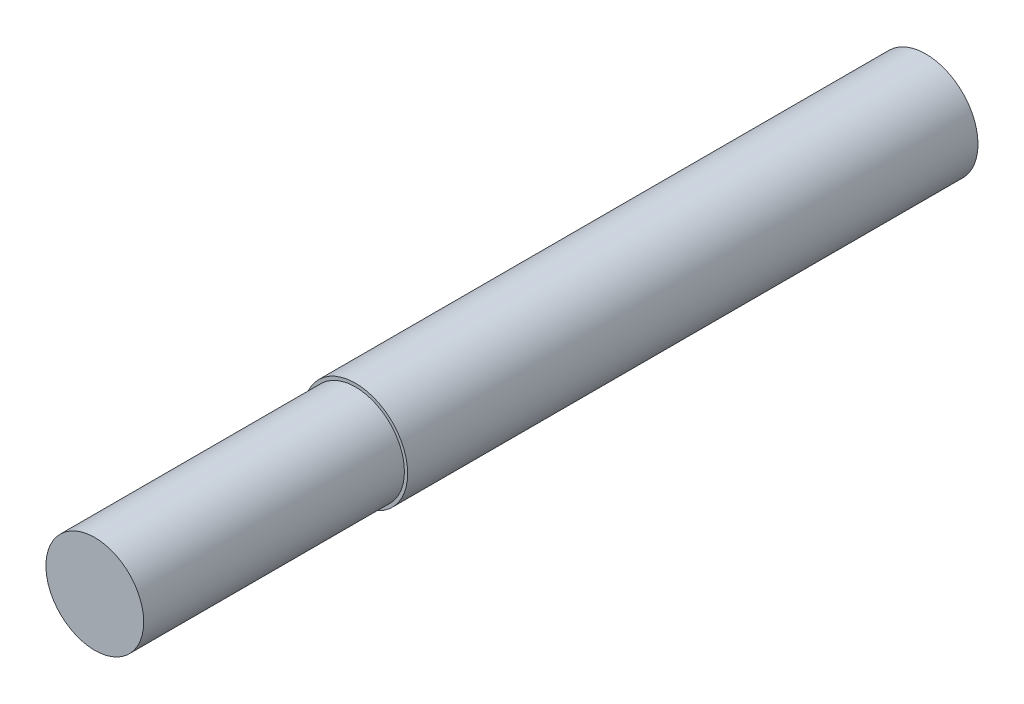
ISO-10303-21;
HEADER;
FILE_DESCRIPTION(('STEP AP214'),'2;1');
FILE_NAME('part.step','',(''),(''),'','','');
FILE_SCHEMA(('AUTOMOTIVE_DESIGN { 1 0 10303 214 1 1 1 1 }'));
ENDSEC;
DATA;
#1=APPLICATION_CONTEXT('core data for automotive mechanical design processes');
#2=APPLICATION_PROTOCOL_DEFINITION('international standard','automotive_design',2000,#1);
#3=PRODUCT_CONTEXT('',#1,'mechanical');
#4=PRODUCT('Part','Part','',(#3));
#5=PRODUCT_RELATED_PRODUCT_CATEGORY('part','',(#4));
#6=PRODUCT_DEFINITION_FORMATION('','',#4);
#7=PRODUCT_DEFINITION_CONTEXT('part definition',#1,'design');
#8=PRODUCT_DEFINITION('design','',#6,#7);
#9=PRODUCT_DEFINITION_SHAPE('','',#8);
#10=(LENGTH_UNIT() NAMED_UNIT(*) SI_UNIT(.MILLI.,.METRE.));
#11=(NAMED_UNIT(*) PLANE_ANGLE_UNIT() SI_UNIT($,.RADIAN.));
#12=(NAMED_UNIT(*) SI_UNIT($,.STERADIAN.) SOLID_ANGLE_UNIT());
#13=UNCERTAINTY_MEASURE_WITH_UNIT(LENGTH_MEASURE(1.E-05),#10,'distance_accuracy_value','');
#14=(GEOMETRIC_REPRESENTATION_CONTEXT(3) GLOBAL_UNCERTAINTY_ASSIGNED_CONTEXT((#13)) GLOBAL_UNIT_ASSIGNED_CONTEXT((#10,
#11,#12)) REPRESENTATION_CONTEXT('',''));
#15=CARTESIAN_POINT('',(0.,0.,0.));
#16=DIRECTION('',(0.,0.,1.));
#17=DIRECTION('',(1.,0.,0.));
#18=AXIS2_PLACEMENT_3D('',#15,#16,#17);
#19=CARTESIAN_POINT('',(0.,0.,0.));
#20=DIRECTION('',(0.,0.,-1.));
#21=DIRECTION('',(-1.,0.,0.));
#22=AXIS2_PLACEMENT_3D('',#19,#20,#21);
#23=PLANE('',#22);
#24=CARTESIAN_POINT('',(0.,0.,0.));
#25=DIRECTION('',(0.,0.,1.));
#26=DIRECTION('',(1.,0.,0.));
#27=AXIS2_PLACEMENT_3D('',#24,#25,#26);
#28=CIRCLE('',#27,1.5);
#29=CARTESIAN_POINT('',(1.5,0.,0.));
#30=VERTEX_POINT('',#29);
#31=EDGE_CURVE('E10',#30,#30,#28,.T.);
#32=ORIENTED_EDGE('',*,*,#31,.T.);
#33=EDGE_LOOP('',(#32));
#34=FACE_BOUND('',#33,.T.);
#35=ADVANCED_FACE('F30',(#34),#23,.F.);
#36=CARTESIAN_POINT('',(0.,0.,0.));
#37=DIRECTION('',(0.,0.,1.));
#38=DIRECTION('',(1.,0.,0.));
#39=AXIS2_PLACEMENT_3D('',#36,#37,#38);
#40=CYLINDRICAL_SURFACE('',#39,1.5);
#41=ORIENTED_EDGE('',*,*,#31,.F.);
#42=EDGE_LOOP('',(#41));
#43=FACE_BOUND('',#42,.T.);
#44=CARTESIAN_POINT('',(0.,0.,-8.));
#45=DIRECTION('',(0.,0.,1.));
#46=DIRECTION('',(1.,0.,0.));
#47=AXIS2_PLACEMENT_3D('',#44,#45,#46);
#48=CIRCLE('',#47,1.5);
#49=CARTESIAN_POINT('',(1.5,0.,-8.));
#50=VERTEX_POINT('',#49);
#51=EDGE_CURVE('E36',#50,#50,#48,.T.);
#52=ORIENTED_EDGE('',*,*,#51,.T.);
#53=EDGE_LOOP('',(#52));
#54=FACE_BOUND('',#53,.T.);
#55=ADVANCED_FACE('F68',(#43,#54),#40,.T.);
#56=CARTESIAN_POINT('',(-1.5,0.,-8.));
#57=DIRECTION('',(0.,0.,-1.));
#58=DIRECTION('',(-1.,0.,0.));
#59=AXIS2_PLACEMENT_3D('',#56,#57,#58);
#60=PLANE('',#59);
#61=ORIENTED_EDGE('',*,*,#51,.F.);
#62=EDGE_LOOP('',(#61));
#63=FACE_BOUND('',#62,.T.);
#64=CARTESIAN_POINT('',(0.,0.,-8.));
#65=DIRECTION('',(0.,0.,1.));
#66=DIRECTION('',(1.,0.,0.));
#67=AXIS2_PLACEMENT_3D('',#64,#65,#66);
#68=CIRCLE('',#67,1.6);
#69=CARTESIAN_POINT('',(1.6,0.,-8.));
#70=VERTEX_POINT('',#69);
#71=EDGE_CURVE('E40',#70,#70,#68,.T.);
#72=ORIENTED_EDGE('',*,*,#71,.T.);
#73=EDGE_LOOP('',(#72));
#74=FACE_BOUND('',#73,.T.);
#75=ADVANCED_FACE('F72',(#63,#74),#60,.F.);
#76=CARTESIAN_POINT('',(0.,0.,0.));
#77=DIRECTION('',(0.,0.,1.));
#78=DIRECTION('',(1.,0.,0.));
#79=AXIS2_PLACEMENT_3D('',#76,#77,#78);
#80=CYLINDRICAL_SURFACE('',#79,1.6);
#81=ORIENTED_EDGE('',*,*,#71,.F.);
#82=EDGE_LOOP('',(#81));
#83=FACE_BOUND('',#82,.T.);
#84=CARTESIAN_POINT('',(0.,0.,-25.5));
#85=DIRECTION('',(0.,0.,1.));
#86=DIRECTION('',(1.,0.,0.));
#87=AXIS2_PLACEMENT_3D('',#84,#85,#86);
#88=CIRCLE('',#87,1.6);
#89=CARTESIAN_POINT('',(1.6,0.,-25.5));
#90=VERTEX_POINT('',#89);
#91=EDGE_CURVE('E44',#90,#90,#88,.T.);
#92=ORIENTED_EDGE('',*,*,#91,.T.);
#93=EDGE_LOOP('',(#92));
#94=FACE_BOUND('',#93,.T.);
#95=ADVANCED_FACE('F77',(#83,#94),#80,.T.);
#96=CARTESIAN_POINT('',(-1.6,0.,-25.5));
#97=DIRECTION('',(0.,0.,1.));
#98=DIRECTION('',(1.,0.,0.));
#99=AXIS2_PLACEMENT_3D('',#96,#97,#98);
#100=PLANE('',#99);
#101=ORIENTED_EDGE('',*,*,#91,.F.);
#102=EDGE_LOOP('',(#101));
#103=FACE_BOUND('',#102,.T.);
#104=CARTESIAN_POINT('',(0.,0.,-25.5));
#105=DIRECTION('',(0.,0.,1.));
#106=DIRECTION('',(1.,0.,0.));
#107=AXIS2_PLACEMENT_3D('',#104,#105,#106);
#108=CIRCLE('',#107,0.75);
#109=CARTESIAN_POINT('',(0.75,0.,-25.5));
#110=VERTEX_POINT('',#109);
#111=EDGE_CURVE('E49',#110,#110,#108,.T.);
#112=ORIENTED_EDGE('',*,*,#111,.T.);
#113=EDGE_LOOP('',(#112));
#114=FACE_BOUND('',#113,.T.);
#115=ADVANCED_FACE('F64',(#103,#114),#100,.F.);
#116=CARTESIAN_POINT('',(0.,0.,0.));
#117=DIRECTION('',(0.,0.,1.));
#118=DIRECTION('',(1.,0.,0.));
#119=AXIS2_PLACEMENT_3D('',#116,#117,#118);
#120=CYLINDRICAL_SURFACE('',#119,0.75);
#121=ORIENTED_EDGE('',*,*,#111,.F.);
#122=EDGE_LOOP('',(#121));
#123=FACE_BOUND('',#122,.T.);
#124=CARTESIAN_POINT('',(0.,0.,-17.5));
#125=DIRECTION('',(0.,0.,1.));
#126=DIRECTION('',(1.,0.,0.));
#127=AXIS2_PLACEMENT_3D('',#124,#125,#126);
#128=CIRCLE('',#127,0.749999999999999);
#129=CARTESIAN_POINT('',(0.749999999999999,0.,-17.5));
#130=VERTEX_POINT('',#129);
#131=EDGE_CURVE('E52',#130,#130,#128,.T.);
#132=ORIENTED_EDGE('',*,*,#131,.T.);
#133=EDGE_LOOP('',(#132));
#134=FACE_BOUND('',#133,.T.);
#135=ADVANCED_FACE('F56',(#123,#134),#120,.F.);
#136=CARTESIAN_POINT('',(-0.749999999999999,0.,-17.5));
#137=DIRECTION('',(0.,0.,1.));
#138=DIRECTION('',(1.,0.,0.));
#139=AXIS2_PLACEMENT_3D('',#136,#137,#138);
#140=PLANE('',#139);
#141=ORIENTED_EDGE('',*,*,#131,.F.);
#142=EDGE_LOOP('',(#141));
#143=FACE_BOUND('',#142,.T.);
#144=ADVANCED_FACE('F58',(#143),#140,.F.);
#145=CLOSED_SHELL('',(#35,#55,#75,#95,#115,#135,#144));
#146=MANIFOLD_SOLID_BREP('B2',#145);
#147=ADVANCED_BREP_SHAPE_REPRESENTATION('',(#18,#146),#14);
#148=SHAPE_DEFINITION_REPRESENTATION(#9,#147);
ENDSEC;
END-ISO-10303-21;
